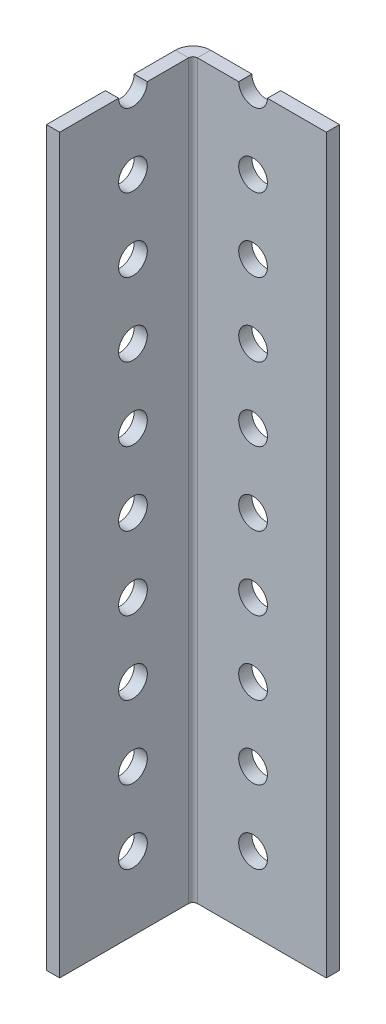
ISO-10303-21;
HEADER;
FILE_DESCRIPTION(('STEP AP214'),'2;1');
FILE_NAME('part.step','',(''),(''),'','','');
FILE_SCHEMA(('AUTOMOTIVE_DESIGN { 1 0 10303 214 1 1 1 1 }'));
ENDSEC;
DATA;
#1=APPLICATION_CONTEXT('core data for automotive mechanical design processes');
#2=APPLICATION_PROTOCOL_DEFINITION('international standard','automotive_design',2000,#1);
#3=PRODUCT_CONTEXT('',#1,'mechanical');
#4=PRODUCT('Part','Part','',(#3));
#5=PRODUCT_RELATED_PRODUCT_CATEGORY('part','',(#4));
#6=PRODUCT_DEFINITION_FORMATION('','',#4);
#7=PRODUCT_DEFINITION_CONTEXT('part definition',#1,'design');
#8=PRODUCT_DEFINITION('design','',#6,#7);
#9=PRODUCT_DEFINITION_SHAPE('','',#8);
#10=(LENGTH_UNIT() NAMED_UNIT(*) SI_UNIT(.MILLI.,.METRE.));
#11=(NAMED_UNIT(*) PLANE_ANGLE_UNIT() SI_UNIT($,.RADIAN.));
#12=(NAMED_UNIT(*) SI_UNIT($,.STERADIAN.) SOLID_ANGLE_UNIT());
#13=UNCERTAINTY_MEASURE_WITH_UNIT(LENGTH_MEASURE(1.E-05),#10,'distance_accuracy_value','');
#14=(GEOMETRIC_REPRESENTATION_CONTEXT(3) GLOBAL_UNCERTAINTY_ASSIGNED_CONTEXT((#13)) GLOBAL_UNIT_ASSIGNED_CONTEXT((#10,
#11,#12)) REPRESENTATION_CONTEXT('',''));
#15=CARTESIAN_POINT('',(0.,0.,0.));
#16=DIRECTION('',(0.,0.,1.));
#17=DIRECTION('',(1.,0.,0.));
#18=AXIS2_PLACEMENT_3D('',#15,#16,#17);
#19=CARTESIAN_POINT('',(0.,0.,18.8155418391894));
#20=DIRECTION('',(0.,1.,0.));
#21=DIRECTION('',(0.,0.,1.));
#22=AXIS2_PLACEMENT_3D('',#19,#20,#21);
#23=PLANE('',#22);
#24=DIRECTION('',(1.,0.,0.));
#25=VECTOR('',#24,1.);
#26=CARTESIAN_POINT('',(0.,0.,25.4));
#27=LINE('',#26,#25);
#28=CARTESIAN_POINT('',(0.,0.,25.4));
#29=VERTEX_POINT('',#28);
#30=CARTESIAN_POINT('',(2.286,0.,25.4));
#31=VERTEX_POINT('',#30);
#32=EDGE_CURVE('E11',#29,#31,#27,.T.);
#33=ORIENTED_EDGE('',*,*,#32,.F.);
#34=DIRECTION('',(0.,0.,1.));
#35=VECTOR('',#34,1.);
#36=CARTESIAN_POINT('',(0.,0.,18.8155418391894));
#37=LINE('',#36,#35);
#38=CARTESIAN_POINT('',(0.,0.,3.048));
#39=VERTEX_POINT('',#38);
#40=EDGE_CURVE('E81',#29,#39,#37,.F.);
#41=ORIENTED_EDGE('',*,*,#40,.T.);
#42=DIRECTION('',(-1.,0.,0.));
#43=VECTOR('',#42,1.);
#44=CARTESIAN_POINT('',(0.,0.,3.048));
#45=LINE('',#44,#43);
#46=CARTESIAN_POINT('',(2.286,0.,3.048));
#47=VERTEX_POINT('',#46);
#48=EDGE_CURVE('E28',#39,#47,#45,.F.);
#49=ORIENTED_EDGE('',*,*,#48,.T.);
#50=DIRECTION('',(0.,0.,-1.));
#51=VECTOR('',#50,1.);
#52=CARTESIAN_POINT('',(2.286,0.,18.8155418391894));
#53=LINE('',#52,#51);
#54=EDGE_CURVE('E279',#31,#47,#53,.T.);
#55=ORIENTED_EDGE('',*,*,#54,.F.);
#56=EDGE_LOOP('',(#33,#41,#49,#55));
#57=FACE_BOUND('',#56,.T.);
#58=ADVANCED_FACE('F17',(#57),#23,.F.);
#59=CARTESIAN_POINT('',(0.,127.,18.8155418391894));
#60=DIRECTION('',(0.,1.,0.));
#61=DIRECTION('',(0.,0.,1.));
#62=AXIS2_PLACEMENT_3D('',#59,#60,#61);
#63=PLANE('',#62);
#64=DIRECTION('',(1.,0.,0.));
#65=VECTOR('',#64,1.);
#66=CARTESIAN_POINT('',(0.,127.,3.048));
#67=LINE('',#66,#65);
#68=CARTESIAN_POINT('',(0.,127.,3.048));
#69=VERTEX_POINT('',#68);
#70=CARTESIAN_POINT('',(2.286,127.,3.048));
#71=VERTEX_POINT('',#70);
#72=EDGE_CURVE('E70',#69,#71,#67,.T.);
#73=ORIENTED_EDGE('',*,*,#72,.F.);
#74=DIRECTION('',(0.,0.,1.));
#75=VECTOR('',#74,1.);
#76=CARTESIAN_POINT('',(0.,127.,18.8155418391894));
#77=LINE('',#76,#75);
#78=CARTESIAN_POINT('',(0.,127.,10.2108));
#79=VERTEX_POINT('',#78);
#80=EDGE_CURVE('E84',#79,#69,#77,.F.);
#81=ORIENTED_EDGE('',*,*,#80,.F.);
#82=DIRECTION('',(1.,0.,0.));
#83=VECTOR('',#82,1.);
#84=CARTESIAN_POINT('',(0.,127.,10.2108));
#85=LINE('',#84,#83);
#86=CARTESIAN_POINT('',(2.28599999999997,127.,10.2108));
#87=VERTEX_POINT('',#86);
#88=EDGE_CURVE('E365',#79,#87,#85,.T.);
#89=ORIENTED_EDGE('',*,*,#88,.T.);
#90=DIRECTION('',(0.,0.,-1.));
#91=VECTOR('',#90,1.);
#92=CARTESIAN_POINT('',(2.286,127.,18.8155418391894));
#93=LINE('',#92,#91);
#94=EDGE_CURVE('E275',#87,#71,#93,.T.);
#95=ORIENTED_EDGE('',*,*,#94,.T.);
#96=EDGE_LOOP('',(#73,#81,#89,#95));
#97=FACE_BOUND('',#96,.T.);
#98=ADVANCED_FACE('F446',(#97),#63,.T.);
#99=CARTESIAN_POINT('',(0.,127.,12.7));
#100=DIRECTION('',(1.,0.,0.));
#101=DIRECTION('',(0.,0.,-1.));
#102=AXIS2_PLACEMENT_3D('',#99,#100,#101);
#103=CYLINDRICAL_SURFACE('',#102,2.4892);
#104=ORIENTED_EDGE('',*,*,#88,.F.);
#105=CARTESIAN_POINT('',(0.,127.,12.7));
#106=DIRECTION('',(-1.,0.,0.));
#107=DIRECTION('',(0.,0.,1.));
#108=AXIS2_PLACEMENT_3D('',#105,#106,#107);
#109=CIRCLE('',#108,2.4892);
#110=CARTESIAN_POINT('',(0.,127.,15.1892));
#111=VERTEX_POINT('',#110);
#112=EDGE_CURVE('E325',#79,#111,#109,.T.);
#113=ORIENTED_EDGE('',*,*,#112,.T.);
#114=DIRECTION('',(1.,0.,0.));
#115=VECTOR('',#114,1.);
#116=CARTESIAN_POINT('',(0.,127.,15.1892));
#117=LINE('',#116,#115);
#118=CARTESIAN_POINT('',(2.28599999999997,127.,15.1892));
#119=VERTEX_POINT('',#118);
#120=EDGE_CURVE('E37',#111,#119,#117,.T.);
#121=ORIENTED_EDGE('',*,*,#120,.T.);
#122=CARTESIAN_POINT('',(2.28599999999997,127.,12.7));
#123=DIRECTION('',(-1.,0.,0.));
#124=DIRECTION('',(0.,0.,1.));
#125=AXIS2_PLACEMENT_3D('',#122,#123,#124);
#126=CIRCLE('',#125,2.4892);
#127=EDGE_CURVE('E270',#87,#119,#126,.T.);
#128=ORIENTED_EDGE('',*,*,#127,.F.);
#129=EDGE_LOOP('',(#104,#113,#121,#128));
#130=FACE_BOUND('',#129,.T.);
#131=ADVANCED_FACE('F450',(#130),#103,.F.);
#132=ORIENTED_EDGE('',*,*,#120,.F.);
#133=CARTESIAN_POINT('',(0.,127.,25.4));
#134=VERTEX_POINT('',#133);
#135=EDGE_CURVE('E264',#134,#111,#77,.F.);
#136=ORIENTED_EDGE('',*,*,#135,.F.);
#137=DIRECTION('',(1.,0.,0.));
#138=VECTOR('',#137,1.);
#139=CARTESIAN_POINT('',(0.,127.,25.4));
#140=LINE('',#139,#138);
#141=CARTESIAN_POINT('',(2.286,127.,25.4));
#142=VERTEX_POINT('',#141);
#143=EDGE_CURVE('E320',#134,#142,#140,.T.);
#144=ORIENTED_EDGE('',*,*,#143,.T.);
#145=DIRECTION('',(0.,0.,-1.));
#146=VECTOR('',#145,1.);
#147=CARTESIAN_POINT('',(2.286,127.,18.8155418391894));
#148=LINE('',#147,#146);
#149=EDGE_CURVE('E265',#142,#119,#148,.T.);
#150=ORIENTED_EDGE('',*,*,#149,.T.);
#151=EDGE_LOOP('',(#132,#136,#144,#150));
#152=FACE_BOUND('',#151,.T.);
#153=ADVANCED_FACE('F452',(#152),#63,.T.);
#154=CARTESIAN_POINT('',(0.,0.,25.4));
#155=DIRECTION('',(0.,0.,-1.));
#156=DIRECTION('',(0.,1.,0.));
#157=AXIS2_PLACEMENT_3D('',#154,#155,#156);
#158=PLANE('',#157);
#159=DIRECTION('',(0.,1.,0.));
#160=VECTOR('',#159,1.);
#161=CARTESIAN_POINT('',(0.,0.,25.4));
#162=LINE('',#161,#160);
#163=EDGE_CURVE('E95',#29,#134,#162,.T.);
#164=ORIENTED_EDGE('',*,*,#163,.F.);
#165=ORIENTED_EDGE('',*,*,#32,.T.);
#166=DIRECTION('',(0.,1.,0.));
#167=VECTOR('',#166,1.);
#168=CARTESIAN_POINT('',(2.286,0.,25.4));
#169=LINE('',#168,#167);
#170=EDGE_CURVE('E268',#31,#142,#169,.T.);
#171=ORIENTED_EDGE('',*,*,#170,.T.);
#172=ORIENTED_EDGE('',*,*,#143,.F.);
#173=EDGE_LOOP('',(#164,#165,#171,#172));
#174=FACE_BOUND('',#173,.T.);
#175=ADVANCED_FACE('F455',(#174),#158,.F.);
#176=CARTESIAN_POINT('',(0.,114.3,12.7));
#177=DIRECTION('',(1.,0.,0.));
#178=DIRECTION('',(0.,0.,-1.));
#179=AXIS2_PLACEMENT_3D('',#176,#177,#178);
#180=CYLINDRICAL_SURFACE('',#179,2.4892);
#181=CARTESIAN_POINT('',(2.28599999999997,114.3,12.7));
#182=DIRECTION('',(-1.,0.,0.));
#183=DIRECTION('',(0.,0.,1.));
#184=AXIS2_PLACEMENT_3D('',#181,#182,#183);
#185=CIRCLE('',#184,2.4892);
#186=CARTESIAN_POINT('',(2.28599999999996,114.3,15.1892));
#187=VERTEX_POINT('',#186);
#188=EDGE_CURVE('E274',#187,#187,#185,.T.);
#189=ORIENTED_EDGE('',*,*,#188,.F.);
#190=EDGE_LOOP('',(#189));
#191=FACE_BOUND('',#190,.T.);
#192=CARTESIAN_POINT('',(0.,114.3,12.7));
#193=DIRECTION('',(-1.,0.,0.));
#194=DIRECTION('',(0.,0.,1.));
#195=AXIS2_PLACEMENT_3D('',#192,#193,#194);
#196=CIRCLE('',#195,2.4892);
#197=CARTESIAN_POINT('',(0.,114.3,15.1892));
#198=VERTEX_POINT('',#197);
#199=EDGE_CURVE('E328',#198,#198,#196,.T.);
#200=ORIENTED_EDGE('',*,*,#199,.T.);
#201=EDGE_LOOP('',(#200));
#202=FACE_BOUND('',#201,.T.);
#203=ADVANCED_FACE('F458',(#191,#202),#180,.F.);
#204=CARTESIAN_POINT('',(0.,101.6,12.7));
#205=DIRECTION('',(1.,0.,0.));
#206=DIRECTION('',(0.,0.,-1.));
#207=AXIS2_PLACEMENT_3D('',#204,#205,#206);
#208=CYLINDRICAL_SURFACE('',#207,2.4892);
#209=CARTESIAN_POINT('',(2.28599999999997,101.6,12.7));
#210=DIRECTION('',(-1.,0.,0.));
#211=DIRECTION('',(0.,0.,1.));
#212=AXIS2_PLACEMENT_3D('',#209,#210,#211);
#213=CIRCLE('',#212,2.4892);
#214=CARTESIAN_POINT('',(2.28599999999996,101.6,15.1892));
#215=VERTEX_POINT('',#214);
#216=EDGE_CURVE('E288',#215,#215,#213,.T.);
#217=ORIENTED_EDGE('',*,*,#216,.F.);
#218=EDGE_LOOP('',(#217));
#219=FACE_BOUND('',#218,.T.);
#220=CARTESIAN_POINT('',(0.,101.6,12.7));
#221=DIRECTION('',(-1.,0.,0.));
#222=DIRECTION('',(0.,0.,1.));
#223=AXIS2_PLACEMENT_3D('',#220,#221,#222);
#224=CIRCLE('',#223,2.4892);
#225=CARTESIAN_POINT('',(0.,101.6,15.1892));
#226=VERTEX_POINT('',#225);
#227=EDGE_CURVE('E332',#226,#226,#224,.T.);
#228=ORIENTED_EDGE('',*,*,#227,.T.);
#229=EDGE_LOOP('',(#228));
#230=FACE_BOUND('',#229,.T.);
#231=ADVANCED_FACE('F462',(#219,#230),#208,.F.);
#232=CARTESIAN_POINT('',(0.,88.9,12.7));
#233=DIRECTION('',(1.,0.,0.));
#234=DIRECTION('',(0.,0.,-1.));
#235=AXIS2_PLACEMENT_3D('',#232,#233,#234);
#236=CYLINDRICAL_SURFACE('',#235,2.4892);
#237=CARTESIAN_POINT('',(2.28599999999997,88.9,12.7));
#238=DIRECTION('',(-1.,0.,0.));
#239=DIRECTION('',(0.,0.,1.));
#240=AXIS2_PLACEMENT_3D('',#237,#238,#239);
#241=CIRCLE('',#240,2.4892);
#242=CARTESIAN_POINT('',(2.28599999999996,88.9,15.1892));
#243=VERTEX_POINT('',#242);
#244=EDGE_CURVE('E292',#243,#243,#241,.T.);
#245=ORIENTED_EDGE('',*,*,#244,.F.);
#246=EDGE_LOOP('',(#245));
#247=FACE_BOUND('',#246,.T.);
#248=CARTESIAN_POINT('',(0.,88.9,12.7));
#249=DIRECTION('',(-1.,0.,0.));
#250=DIRECTION('',(0.,0.,1.));
#251=AXIS2_PLACEMENT_3D('',#248,#249,#250);
#252=CIRCLE('',#251,2.4892);
#253=CARTESIAN_POINT('',(0.,88.9,15.1892));
#254=VERTEX_POINT('',#253);
#255=EDGE_CURVE('E336',#254,#254,#252,.T.);
#256=ORIENTED_EDGE('',*,*,#255,.T.);
#257=EDGE_LOOP('',(#256));
#258=FACE_BOUND('',#257,.T.);
#259=ADVANCED_FACE('F466',(#247,#258),#236,.F.);
#260=CARTESIAN_POINT('',(0.,76.2,12.7));
#261=DIRECTION('',(1.,0.,0.));
#262=DIRECTION('',(0.,0.,-1.));
#263=AXIS2_PLACEMENT_3D('',#260,#261,#262);
#264=CYLINDRICAL_SURFACE('',#263,2.4892);
#265=CARTESIAN_POINT('',(2.28599999999997,76.2,12.7));
#266=DIRECTION('',(-1.,0.,0.));
#267=DIRECTION('',(0.,0.,1.));
#268=AXIS2_PLACEMENT_3D('',#265,#266,#267);
#269=CIRCLE('',#268,2.4892);
#270=CARTESIAN_POINT('',(2.28599999999996,76.2,15.1892));
#271=VERTEX_POINT('',#270);
#272=EDGE_CURVE('E296',#271,#271,#269,.T.);
#273=ORIENTED_EDGE('',*,*,#272,.F.);
#274=EDGE_LOOP('',(#273));
#275=FACE_BOUND('',#274,.T.);
#276=CARTESIAN_POINT('',(0.,76.2,12.7));
#277=DIRECTION('',(-1.,0.,0.));
#278=DIRECTION('',(0.,0.,1.));
#279=AXIS2_PLACEMENT_3D('',#276,#277,#278);
#280=CIRCLE('',#279,2.4892);
#281=CARTESIAN_POINT('',(0.,76.2,15.1892));
#282=VERTEX_POINT('',#281);
#283=EDGE_CURVE('E340',#282,#282,#280,.T.);
#284=ORIENTED_EDGE('',*,*,#283,.T.);
#285=EDGE_LOOP('',(#284));
#286=FACE_BOUND('',#285,.T.);
#287=ADVANCED_FACE('F470',(#275,#286),#264,.F.);
#288=CARTESIAN_POINT('',(0.,63.5,12.7));
#289=DIRECTION('',(1.,0.,0.));
#290=DIRECTION('',(0.,0.,-1.));
#291=AXIS2_PLACEMENT_3D('',#288,#289,#290);
#292=CYLINDRICAL_SURFACE('',#291,2.4892);
#293=CARTESIAN_POINT('',(2.28599999999997,63.5,12.7));
#294=DIRECTION('',(-1.,0.,0.));
#295=DIRECTION('',(0.,0.,1.));
#296=AXIS2_PLACEMENT_3D('',#293,#294,#295);
#297=CIRCLE('',#296,2.4892);
#298=CARTESIAN_POINT('',(2.28599999999996,63.5,15.1892));
#299=VERTEX_POINT('',#298);
#300=EDGE_CURVE('E300',#299,#299,#297,.T.);
#301=ORIENTED_EDGE('',*,*,#300,.F.);
#302=EDGE_LOOP('',(#301));
#303=FACE_BOUND('',#302,.T.);
#304=CARTESIAN_POINT('',(0.,63.5,12.7));
#305=DIRECTION('',(-1.,0.,0.));
#306=DIRECTION('',(0.,0.,1.));
#307=AXIS2_PLACEMENT_3D('',#304,#305,#306);
#308=CIRCLE('',#307,2.4892);
#309=CARTESIAN_POINT('',(0.,63.5,15.1892));
#310=VERTEX_POINT('',#309);
#311=EDGE_CURVE('E344',#310,#310,#308,.T.);
#312=ORIENTED_EDGE('',*,*,#311,.T.);
#313=EDGE_LOOP('',(#312));
#314=FACE_BOUND('',#313,.T.);
#315=ADVANCED_FACE('F474',(#303,#314),#292,.F.);
#316=CARTESIAN_POINT('',(0.,50.8,12.7));
#317=DIRECTION('',(1.,0.,0.));
#318=DIRECTION('',(0.,0.,-1.));
#319=AXIS2_PLACEMENT_3D('',#316,#317,#318);
#320=CYLINDRICAL_SURFACE('',#319,2.4892);
#321=CARTESIAN_POINT('',(2.28599999999997,50.8,12.7));
#322=DIRECTION('',(-1.,0.,0.));
#323=DIRECTION('',(0.,0.,1.));
#324=AXIS2_PLACEMENT_3D('',#321,#322,#323);
#325=CIRCLE('',#324,2.4892);
#326=CARTESIAN_POINT('',(2.28599999999996,50.8,15.1892));
#327=VERTEX_POINT('',#326);
#328=EDGE_CURVE('E304',#327,#327,#325,.T.);
#329=ORIENTED_EDGE('',*,*,#328,.F.);
#330=EDGE_LOOP('',(#329));
#331=FACE_BOUND('',#330,.T.);
#332=CARTESIAN_POINT('',(0.,50.8,12.7));
#333=DIRECTION('',(-1.,0.,0.));
#334=DIRECTION('',(0.,0.,1.));
#335=AXIS2_PLACEMENT_3D('',#332,#333,#334);
#336=CIRCLE('',#335,2.4892);
#337=CARTESIAN_POINT('',(0.,50.8,15.1892));
#338=VERTEX_POINT('',#337);
#339=EDGE_CURVE('E348',#338,#338,#336,.T.);
#340=ORIENTED_EDGE('',*,*,#339,.T.);
#341=EDGE_LOOP('',(#340));
#342=FACE_BOUND('',#341,.T.);
#343=ADVANCED_FACE('F478',(#331,#342),#320,.F.);
#344=CARTESIAN_POINT('',(0.,38.1,12.7));
#345=DIRECTION('',(1.,0.,0.));
#346=DIRECTION('',(0.,0.,-1.));
#347=AXIS2_PLACEMENT_3D('',#344,#345,#346);
#348=CYLINDRICAL_SURFACE('',#347,2.4892);
#349=CARTESIAN_POINT('',(2.28599999999997,38.1,12.7));
#350=DIRECTION('',(-1.,0.,0.));
#351=DIRECTION('',(0.,0.,1.));
#352=AXIS2_PLACEMENT_3D('',#349,#350,#351);
#353=CIRCLE('',#352,2.4892);
#354=CARTESIAN_POINT('',(2.28599999999996,38.1,15.1892));
#355=VERTEX_POINT('',#354);
#356=EDGE_CURVE('E308',#355,#355,#353,.T.);
#357=ORIENTED_EDGE('',*,*,#356,.F.);
#358=EDGE_LOOP('',(#357));
#359=FACE_BOUND('',#358,.T.);
#360=CARTESIAN_POINT('',(0.,38.1,12.7));
#361=DIRECTION('',(-1.,0.,0.));
#362=DIRECTION('',(0.,0.,1.));
#363=AXIS2_PLACEMENT_3D('',#360,#361,#362);
#364=CIRCLE('',#363,2.4892);
#365=CARTESIAN_POINT('',(0.,38.1,15.1892));
#366=VERTEX_POINT('',#365);
#367=EDGE_CURVE('E352',#366,#366,#364,.T.);
#368=ORIENTED_EDGE('',*,*,#367,.T.);
#369=EDGE_LOOP('',(#368));
#370=FACE_BOUND('',#369,.T.);
#371=ADVANCED_FACE('F482',(#359,#370),#348,.F.);
#372=CARTESIAN_POINT('',(0.,25.4,12.7));
#373=DIRECTION('',(1.,0.,0.));
#374=DIRECTION('',(0.,0.,-1.));
#375=AXIS2_PLACEMENT_3D('',#372,#373,#374);
#376=CYLINDRICAL_SURFACE('',#375,2.4892);
#377=CARTESIAN_POINT('',(2.28599999999997,25.4,12.7));
#378=DIRECTION('',(-1.,0.,0.));
#379=DIRECTION('',(0.,0.,1.));
#380=AXIS2_PLACEMENT_3D('',#377,#378,#379);
#381=CIRCLE('',#380,2.4892);
#382=CARTESIAN_POINT('',(2.28599999999996,25.4,15.1892));
#383=VERTEX_POINT('',#382);
#384=EDGE_CURVE('E312',#383,#383,#381,.T.);
#385=ORIENTED_EDGE('',*,*,#384,.F.);
#386=EDGE_LOOP('',(#385));
#387=FACE_BOUND('',#386,.T.);
#388=CARTESIAN_POINT('',(0.,25.4,12.7));
#389=DIRECTION('',(-1.,0.,0.));
#390=DIRECTION('',(0.,0.,1.));
#391=AXIS2_PLACEMENT_3D('',#388,#389,#390);
#392=CIRCLE('',#391,2.4892);
#393=CARTESIAN_POINT('',(0.,25.4,15.1892));
#394=VERTEX_POINT('',#393);
#395=EDGE_CURVE('E356',#394,#394,#392,.T.);
#396=ORIENTED_EDGE('',*,*,#395,.T.);
#397=EDGE_LOOP('',(#396));
#398=FACE_BOUND('',#397,.T.);
#399=ADVANCED_FACE('F485',(#387,#398),#376,.F.);
#400=CARTESIAN_POINT('',(0.,12.7,12.7));
#401=DIRECTION('',(1.,0.,0.));
#402=DIRECTION('',(0.,0.,-1.));
#403=AXIS2_PLACEMENT_3D('',#400,#401,#402);
#404=CYLINDRICAL_SURFACE('',#403,2.4892);
#405=CARTESIAN_POINT('',(2.28599999999997,12.7,12.7));
#406=DIRECTION('',(-1.,0.,0.));
#407=DIRECTION('',(0.,0.,1.));
#408=AXIS2_PLACEMENT_3D('',#405,#406,#407);
#409=CIRCLE('',#408,2.4892);
#410=CARTESIAN_POINT('',(2.28599999999996,12.7,15.1892));
#411=VERTEX_POINT('',#410);
#412=EDGE_CURVE('E316',#411,#411,#409,.T.);
#413=ORIENTED_EDGE('',*,*,#412,.F.);
#414=EDGE_LOOP('',(#413));
#415=FACE_BOUND('',#414,.T.);
#416=CARTESIAN_POINT('',(0.,12.7,12.7));
#417=DIRECTION('',(-1.,0.,0.));
#418=DIRECTION('',(0.,0.,1.));
#419=AXIS2_PLACEMENT_3D('',#416,#417,#418);
#420=CIRCLE('',#419,2.4892);
#421=CARTESIAN_POINT('',(0.,12.7,15.1892));
#422=VERTEX_POINT('',#421);
#423=EDGE_CURVE('E269',#422,#422,#420,.T.);
#424=ORIENTED_EDGE('',*,*,#423,.T.);
#425=EDGE_LOOP('',(#424));
#426=FACE_BOUND('',#425,.T.);
#427=ADVANCED_FACE('F19',(#415,#426),#404,.F.);
#428=CARTESIAN_POINT('',(2.286,0.,18.8155418391894));
#429=DIRECTION('',(1.,0.,0.));
#430=DIRECTION('',(0.,0.,-1.));
#431=AXIS2_PLACEMENT_3D('',#428,#429,#430);
#432=PLANE('',#431);
#433=ORIENTED_EDGE('',*,*,#149,.F.);
#434=ORIENTED_EDGE('',*,*,#170,.F.);
#435=ORIENTED_EDGE('',*,*,#54,.T.);
#436=DIRECTION('',(0.,1.,0.));
#437=VECTOR('',#436,1.);
#438=CARTESIAN_POINT('',(2.286,0.,3.048));
#439=LINE('',#438,#437);
#440=EDGE_CURVE('E278',#47,#71,#439,.T.);
#441=ORIENTED_EDGE('',*,*,#440,.T.);
#442=ORIENTED_EDGE('',*,*,#94,.F.);
#443=ORIENTED_EDGE('',*,*,#127,.T.);
#444=EDGE_LOOP('',(#433,#434,#435,#441,#442,#443));
#445=FACE_BOUND('',#444,.T.);
#446=ORIENTED_EDGE('',*,*,#188,.T.);
#447=EDGE_LOOP('',(#446));
#448=FACE_BOUND('',#447,.T.);
#449=ORIENTED_EDGE('',*,*,#216,.T.);
#450=EDGE_LOOP('',(#449));
#451=FACE_BOUND('',#450,.T.);
#452=ORIENTED_EDGE('',*,*,#244,.T.);
#453=EDGE_LOOP('',(#452));
#454=FACE_BOUND('',#453,.T.);
#455=ORIENTED_EDGE('',*,*,#272,.T.);
#456=EDGE_LOOP('',(#455));
#457=FACE_BOUND('',#456,.T.);
#458=ORIENTED_EDGE('',*,*,#300,.T.);
#459=EDGE_LOOP('',(#458));
#460=FACE_BOUND('',#459,.T.);
#461=ORIENTED_EDGE('',*,*,#328,.T.);
#462=EDGE_LOOP('',(#461));
#463=FACE_BOUND('',#462,.T.);
#464=ORIENTED_EDGE('',*,*,#356,.T.);
#465=EDGE_LOOP('',(#464));
#466=FACE_BOUND('',#465,.T.);
#467=ORIENTED_EDGE('',*,*,#384,.T.);
#468=EDGE_LOOP('',(#467));
#469=FACE_BOUND('',#468,.T.);
#470=ORIENTED_EDGE('',*,*,#412,.T.);
#471=EDGE_LOOP('',(#470));
#472=FACE_BOUND('',#471,.T.);
#473=ADVANCED_FACE('F491',(#445,#448,#451,#454,#457,#460,#463,#466,#469,#472),#432,.T.);
#474=CARTESIAN_POINT('',(0.,0.,18.8155418391894));
#475=DIRECTION('',(1.,0.,0.));
#476=DIRECTION('',(0.,0.,-1.));
#477=AXIS2_PLACEMENT_3D('',#474,#475,#476);
#478=PLANE('',#477);
#479=ORIENTED_EDGE('',*,*,#135,.T.);
#480=ORIENTED_EDGE('',*,*,#112,.F.);
#481=ORIENTED_EDGE('',*,*,#80,.T.);
#482=DIRECTION('',(0.,1.,0.));
#483=VECTOR('',#482,1.);
#484=CARTESIAN_POINT('',(0.,0.,3.048));
#485=LINE('',#484,#483);
#486=EDGE_CURVE('E21',#39,#69,#485,.T.);
#487=ORIENTED_EDGE('',*,*,#486,.F.);
#488=ORIENTED_EDGE('',*,*,#40,.F.);
#489=ORIENTED_EDGE('',*,*,#163,.T.);
#490=EDGE_LOOP('',(#479,#480,#481,#487,#488,#489));
#491=FACE_BOUND('',#490,.T.);
#492=ORIENTED_EDGE('',*,*,#199,.F.);
#493=EDGE_LOOP('',(#492));
#494=FACE_BOUND('',#493,.T.);
#495=ORIENTED_EDGE('',*,*,#227,.F.);
#496=EDGE_LOOP('',(#495));
#497=FACE_BOUND('',#496,.T.);
#498=ORIENTED_EDGE('',*,*,#255,.F.);
#499=EDGE_LOOP('',(#498));
#500=FACE_BOUND('',#499,.T.);
#501=ORIENTED_EDGE('',*,*,#283,.F.);
#502=EDGE_LOOP('',(#501));
#503=FACE_BOUND('',#502,.T.);
#504=ORIENTED_EDGE('',*,*,#311,.F.);
#505=EDGE_LOOP('',(#504));
#506=FACE_BOUND('',#505,.T.);
#507=ORIENTED_EDGE('',*,*,#339,.F.);
#508=EDGE_LOOP('',(#507));
#509=FACE_BOUND('',#508,.T.);
#510=ORIENTED_EDGE('',*,*,#367,.F.);
#511=EDGE_LOOP('',(#510));
#512=FACE_BOUND('',#511,.T.);
#513=ORIENTED_EDGE('',*,*,#395,.F.);
#514=EDGE_LOOP('',(#513));
#515=FACE_BOUND('',#514,.T.);
#516=ORIENTED_EDGE('',*,*,#423,.F.);
#517=EDGE_LOOP('',(#516));
#518=FACE_BOUND('',#517,.T.);
#519=ADVANCED_FACE('F78',(#491,#494,#497,#500,#503,#506,#509,#512,#515,#518),#478,.F.);
#520=CARTESIAN_POINT('',(15.3032662346959,0.,0.));
#521=DIRECTION('',(0.,-1.,0.));
#522=DIRECTION('',(1.,0.,0.));
#523=AXIS2_PLACEMENT_3D('',#520,#521,#522);
#524=PLANE('',#523);
#525=DIRECTION('',(0.,0.,-1.));
#526=VECTOR('',#525,1.);
#527=CARTESIAN_POINT('',(3.048,0.,0.));
#528=LINE('',#527,#526);
#529=CARTESIAN_POINT('',(3.048,0.,0.));
#530=VERTEX_POINT('',#529);
#531=CARTESIAN_POINT('',(3.048,0.,2.286));
#532=VERTEX_POINT('',#531);
#533=EDGE_CURVE('E253',#530,#532,#528,.F.);
#534=ORIENTED_EDGE('',*,*,#533,.F.);
#535=DIRECTION('',(1.,0.,0.));
#536=VECTOR('',#535,1.);
#537=CARTESIAN_POINT('',(15.3032662346959,0.,0.));
#538=LINE('',#537,#536);
#539=CARTESIAN_POINT('',(25.4,0.,0.));
#540=VERTEX_POINT('',#539);
#541=EDGE_CURVE('E194',#530,#540,#538,.T.);
#542=ORIENTED_EDGE('',*,*,#541,.T.);
#543=DIRECTION('',(0.,0.,1.));
#544=VECTOR('',#543,1.);
#545=CARTESIAN_POINT('',(25.4,0.,0.));
#546=LINE('',#545,#544);
#547=CARTESIAN_POINT('',(25.4,0.,2.286));
#548=VERTEX_POINT('',#547);
#549=EDGE_CURVE('E249',#540,#548,#546,.T.);
#550=ORIENTED_EDGE('',*,*,#549,.T.);
#551=DIRECTION('',(1.,0.,0.));
#552=VECTOR('',#551,1.);
#553=CARTESIAN_POINT('',(15.3032662346959,0.,2.286));
#554=LINE('',#553,#552);
#555=EDGE_CURVE('E150',#532,#548,#554,.T.);
#556=ORIENTED_EDGE('',*,*,#555,.F.);
#557=EDGE_LOOP('',(#534,#542,#550,#556));
#558=FACE_BOUND('',#557,.T.);
#559=ADVANCED_FACE('F396',(#558),#524,.T.);
#560=CARTESIAN_POINT('',(25.4,0.,0.));
#561=DIRECTION('',(1.,0.,0.));
#562=DIRECTION('',(0.,1.,0.));
#563=AXIS2_PLACEMENT_3D('',#560,#561,#562);
#564=PLANE('',#563);
#565=ORIENTED_EDGE('',*,*,#549,.F.);
#566=DIRECTION('',(0.,1.,0.));
#567=VECTOR('',#566,1.);
#568=CARTESIAN_POINT('',(25.4,0.,0.));
#569=LINE('',#568,#567);
#570=CARTESIAN_POINT('',(25.4,127.,0.));
#571=VERTEX_POINT('',#570);
#572=EDGE_CURVE('E198',#540,#571,#569,.T.);
#573=ORIENTED_EDGE('',*,*,#572,.T.);
#574=DIRECTION('',(0.,0.,1.));
#575=VECTOR('',#574,1.);
#576=CARTESIAN_POINT('',(25.4,127.,0.));
#577=LINE('',#576,#575);
#578=CARTESIAN_POINT('',(25.4,127.,2.286));
#579=VERTEX_POINT('',#578);
#580=EDGE_CURVE('E245',#571,#579,#577,.T.);
#581=ORIENTED_EDGE('',*,*,#580,.T.);
#582=DIRECTION('',(0.,1.,0.));
#583=VECTOR('',#582,1.);
#584=CARTESIAN_POINT('',(25.4,0.,2.286));
#585=LINE('',#584,#583);
#586=EDGE_CURVE('E146',#548,#579,#585,.T.);
#587=ORIENTED_EDGE('',*,*,#586,.F.);
#588=EDGE_LOOP('',(#565,#573,#581,#587));
#589=FACE_BOUND('',#588,.T.);
#590=ADVANCED_FACE('F404',(#589),#564,.T.);
#591=CARTESIAN_POINT('',(15.3032662346959,127.,0.));
#592=DIRECTION('',(0.,-1.,0.));
#593=DIRECTION('',(1.,0.,0.));
#594=AXIS2_PLACEMENT_3D('',#591,#592,#593);
#595=PLANE('',#594);
#596=ORIENTED_EDGE('',*,*,#580,.F.);
#597=DIRECTION('',(1.,0.,0.));
#598=VECTOR('',#597,1.);
#599=CARTESIAN_POINT('',(15.3032662346959,127.,0.));
#600=LINE('',#599,#598);
#601=CARTESIAN_POINT('',(15.1892,127.,0.));
#602=VERTEX_POINT('',#601);
#603=EDGE_CURVE('E193',#602,#571,#600,.T.);
#604=ORIENTED_EDGE('',*,*,#603,.F.);
#605=DIRECTION('',(0.,0.,1.));
#606=VECTOR('',#605,1.);
#607=CARTESIAN_POINT('',(15.1892,127.,0.));
#608=LINE('',#607,#606);
#609=CARTESIAN_POINT('',(15.1892,127.,2.286));
#610=VERTEX_POINT('',#609);
#611=EDGE_CURVE('E241',#602,#610,#608,.T.);
#612=ORIENTED_EDGE('',*,*,#611,.T.);
#613=DIRECTION('',(1.,0.,0.));
#614=VECTOR('',#613,1.);
#615=CARTESIAN_POINT('',(15.3032662346959,127.,2.286));
#616=LINE('',#615,#614);
#617=EDGE_CURVE('E142',#610,#579,#616,.T.);
#618=ORIENTED_EDGE('',*,*,#617,.T.);
#619=EDGE_LOOP('',(#596,#604,#612,#618));
#620=FACE_BOUND('',#619,.T.);
#621=ADVANCED_FACE('F420',(#620),#595,.F.);
#622=CARTESIAN_POINT('',(12.7,127.,0.));
#623=DIRECTION('',(0.,0.,1.));
#624=DIRECTION('',(1.,0.,0.));
#625=AXIS2_PLACEMENT_3D('',#622,#623,#624);
#626=CYLINDRICAL_SURFACE('',#625,2.4892);
#627=ORIENTED_EDGE('',*,*,#611,.F.);
#628=CARTESIAN_POINT('',(12.7,127.,0.));
#629=DIRECTION('',(0.,0.,1.));
#630=DIRECTION('',(1.,0.,0.));
#631=AXIS2_PLACEMENT_3D('',#628,#629,#630);
#632=CIRCLE('',#631,2.4892);
#633=CARTESIAN_POINT('',(10.2108,127.,0.));
#634=VERTEX_POINT('',#633);
#635=EDGE_CURVE('E202',#634,#602,#632,.T.);
#636=ORIENTED_EDGE('',*,*,#635,.F.);
#637=DIRECTION('',(0.,0.,1.));
#638=VECTOR('',#637,1.);
#639=CARTESIAN_POINT('',(10.2108,127.,0.));
#640=LINE('',#639,#638);
#641=CARTESIAN_POINT('',(10.2108,127.,2.286));
#642=VERTEX_POINT('',#641);
#643=EDGE_CURVE('E237',#634,#642,#640,.T.);
#644=ORIENTED_EDGE('',*,*,#643,.T.);
#645=CARTESIAN_POINT('',(12.7,127.,2.286));
#646=DIRECTION('',(0.,0.,1.));
#647=DIRECTION('',(1.,0.,0.));
#648=AXIS2_PLACEMENT_3D('',#645,#646,#647);
#649=CIRCLE('',#648,2.4892);
#650=EDGE_CURVE('E137',#642,#610,#649,.T.);
#651=ORIENTED_EDGE('',*,*,#650,.T.);
#652=EDGE_LOOP('',(#627,#636,#644,#651));
#653=FACE_BOUND('',#652,.T.);
#654=ADVANCED_FACE('F435',(#653),#626,.F.);
#655=ORIENTED_EDGE('',*,*,#643,.F.);
#656=CARTESIAN_POINT('',(3.048,127.,0.));
#657=VERTEX_POINT('',#656);
#658=EDGE_CURVE('E189',#657,#634,#600,.T.);
#659=ORIENTED_EDGE('',*,*,#658,.F.);
#660=DIRECTION('',(0.,0.,1.));
#661=VECTOR('',#660,1.);
#662=CARTESIAN_POINT('',(3.048,127.,0.));
#663=LINE('',#662,#661);
#664=CARTESIAN_POINT('',(3.048,127.,2.286));
#665=VERTEX_POINT('',#664);
#666=EDGE_CURVE('E185',#657,#665,#663,.T.);
#667=ORIENTED_EDGE('',*,*,#666,.T.);
#668=DIRECTION('',(1.,0.,0.));
#669=VECTOR('',#668,1.);
#670=CARTESIAN_POINT('',(15.3032662346959,127.,2.286));
#671=LINE('',#670,#669);
#672=EDGE_CURVE('E131',#665,#642,#671,.T.);
#673=ORIENTED_EDGE('',*,*,#672,.T.);
#674=EDGE_LOOP('',(#655,#659,#667,#673));
#675=FACE_BOUND('',#674,.T.);
#676=ADVANCED_FACE('F434',(#675),#595,.F.);
#677=CARTESIAN_POINT('',(12.7,12.7,0.));
#678=DIRECTION('',(0.,0.,1.));
#679=DIRECTION('',(1.,0.,0.));
#680=AXIS2_PLACEMENT_3D('',#677,#678,#679);
#681=CYLINDRICAL_SURFACE('',#680,2.4892);
#682=CARTESIAN_POINT('',(12.7,12.7,2.286));
#683=DIRECTION('',(0.,0.,1.));
#684=DIRECTION('',(1.,0.,0.));
#685=AXIS2_PLACEMENT_3D('',#682,#683,#684);
#686=CIRCLE('',#685,2.4892);
#687=CARTESIAN_POINT('',(15.1892,12.7,2.286));
#688=VERTEX_POINT('',#687);
#689=EDGE_CURVE('E128',#688,#688,#686,.T.);
#690=ORIENTED_EDGE('',*,*,#689,.T.);
#691=EDGE_LOOP('',(#690));
#692=FACE_BOUND('',#691,.T.);
#693=CARTESIAN_POINT('',(12.7,12.7,0.));
#694=DIRECTION('',(0.,0.,1.));
#695=DIRECTION('',(1.,0.,0.));
#696=AXIS2_PLACEMENT_3D('',#693,#694,#695);
#697=CIRCLE('',#696,2.4892);
#698=CARTESIAN_POINT('',(15.1892,12.7,0.));
#699=VERTEX_POINT('',#698);
#700=EDGE_CURVE('E120',#699,#699,#697,.T.);
#701=ORIENTED_EDGE('',*,*,#700,.F.);
#702=EDGE_LOOP('',(#701));
#703=FACE_BOUND('',#702,.T.);
#704=ADVANCED_FACE('F442',(#692,#703),#681,.F.);
#705=CARTESIAN_POINT('',(12.7,25.4,0.));
#706=DIRECTION('',(0.,0.,1.));
#707=DIRECTION('',(1.,0.,0.));
#708=AXIS2_PLACEMENT_3D('',#705,#706,#707);
#709=CYLINDRICAL_SURFACE('',#708,2.4892);
#710=CARTESIAN_POINT('',(12.7,25.4,2.286));
#711=DIRECTION('',(0.,0.,1.));
#712=DIRECTION('',(1.,0.,0.));
#713=AXIS2_PLACEMENT_3D('',#710,#711,#712);
#714=CIRCLE('',#713,2.4892);
#715=CARTESIAN_POINT('',(15.1892,25.4,2.286));
#716=VERTEX_POINT('',#715);
#717=EDGE_CURVE('E141',#716,#716,#714,.T.);
#718=ORIENTED_EDGE('',*,*,#717,.T.);
#719=EDGE_LOOP('',(#718));
#720=FACE_BOUND('',#719,.T.);
#721=CARTESIAN_POINT('',(12.7,25.4,0.));
#722=DIRECTION('',(0.,0.,1.));
#723=DIRECTION('',(1.,0.,0.));
#724=AXIS2_PLACEMENT_3D('',#721,#722,#723);
#725=CIRCLE('',#724,2.4892);
#726=CARTESIAN_POINT('',(15.1892,25.4,0.));
#727=VERTEX_POINT('',#726);
#728=EDGE_CURVE('E206',#727,#727,#725,.T.);
#729=ORIENTED_EDGE('',*,*,#728,.F.);
#730=EDGE_LOOP('',(#729));
#731=FACE_BOUND('',#730,.T.);
#732=ADVANCED_FACE('F670',(#720,#731),#709,.F.);
#733=CARTESIAN_POINT('',(12.7,38.1,0.));
#734=DIRECTION('',(0.,0.,1.));
#735=DIRECTION('',(1.,0.,0.));
#736=AXIS2_PLACEMENT_3D('',#733,#734,#735);
#737=CYLINDRICAL_SURFACE('',#736,2.4892);
#738=CARTESIAN_POINT('',(12.7,38.1,2.286));
#739=DIRECTION('',(0.,0.,1.));
#740=DIRECTION('',(1.,0.,0.));
#741=AXIS2_PLACEMENT_3D('',#738,#739,#740);
#742=CIRCLE('',#741,2.4892);
#743=CARTESIAN_POINT('',(15.1892,38.1,2.286));
#744=VERTEX_POINT('',#743);
#745=EDGE_CURVE('E157',#744,#744,#742,.T.);
#746=ORIENTED_EDGE('',*,*,#745,.T.);
#747=EDGE_LOOP('',(#746));
#748=FACE_BOUND('',#747,.T.);
#749=CARTESIAN_POINT('',(12.7,38.1,0.));
#750=DIRECTION('',(0.,0.,1.));
#751=DIRECTION('',(1.,0.,0.));
#752=AXIS2_PLACEMENT_3D('',#749,#750,#751);
#753=CIRCLE('',#752,2.4892);
#754=CARTESIAN_POINT('',(15.1892,38.1,0.));
#755=VERTEX_POINT('',#754);
#756=EDGE_CURVE('E210',#755,#755,#753,.T.);
#757=ORIENTED_EDGE('',*,*,#756,.F.);
#758=EDGE_LOOP('',(#757));
#759=FACE_BOUND('',#758,.T.);
#760=ADVANCED_FACE('F679',(#748,#759),#737,.F.);
#761=CARTESIAN_POINT('',(12.7,50.8,0.));
#762=DIRECTION('',(0.,0.,1.));
#763=DIRECTION('',(1.,0.,0.));
#764=AXIS2_PLACEMENT_3D('',#761,#762,#763);
#765=CYLINDRICAL_SURFACE('',#764,2.4892);
#766=CARTESIAN_POINT('',(12.7,50.8,2.286));
#767=DIRECTION('',(0.,0.,1.));
#768=DIRECTION('',(1.,0.,0.));
#769=AXIS2_PLACEMENT_3D('',#766,#767,#768);
#770=CIRCLE('',#769,2.4892);
#771=CARTESIAN_POINT('',(15.1892,50.8,2.286));
#772=VERTEX_POINT('',#771);
#773=EDGE_CURVE('E161',#772,#772,#770,.T.);
#774=ORIENTED_EDGE('',*,*,#773,.T.);
#775=EDGE_LOOP('',(#774));
#776=FACE_BOUND('',#775,.T.);
#777=CARTESIAN_POINT('',(12.7,50.8,0.));
#778=DIRECTION('',(0.,0.,1.));
#779=DIRECTION('',(1.,0.,0.));
#780=AXIS2_PLACEMENT_3D('',#777,#778,#779);
#781=CIRCLE('',#780,2.4892);
#782=CARTESIAN_POINT('',(15.1892,50.8,0.));
#783=VERTEX_POINT('',#782);
#784=EDGE_CURVE('E214',#783,#783,#781,.T.);
#785=ORIENTED_EDGE('',*,*,#784,.F.);
#786=EDGE_LOOP('',(#785));
#787=FACE_BOUND('',#786,.T.);
#788=ADVANCED_FACE('F688',(#776,#787),#765,.F.);
#789=CARTESIAN_POINT('',(12.7,63.5,0.));
#790=DIRECTION('',(0.,0.,1.));
#791=DIRECTION('',(1.,0.,0.));
#792=AXIS2_PLACEMENT_3D('',#789,#790,#791);
#793=CYLINDRICAL_SURFACE('',#792,2.4892);
#794=CARTESIAN_POINT('',(12.7,63.5,2.286));
#795=DIRECTION('',(0.,0.,1.));
#796=DIRECTION('',(1.,0.,0.));
#797=AXIS2_PLACEMENT_3D('',#794,#795,#796);
#798=CIRCLE('',#797,2.4892);
#799=CARTESIAN_POINT('',(15.1892,63.5,2.286));
#800=VERTEX_POINT('',#799);
#801=EDGE_CURVE('E165',#800,#800,#798,.T.);
#802=ORIENTED_EDGE('',*,*,#801,.T.);
#803=EDGE_LOOP('',(#802));
#804=FACE_BOUND('',#803,.T.);
#805=CARTESIAN_POINT('',(12.7,63.5,0.));
#806=DIRECTION('',(0.,0.,1.));
#807=DIRECTION('',(1.,0.,0.));
#808=AXIS2_PLACEMENT_3D('',#805,#806,#807);
#809=CIRCLE('',#808,2.4892);
#810=CARTESIAN_POINT('',(15.1892,63.5,0.));
#811=VERTEX_POINT('',#810);
#812=EDGE_CURVE('E218',#811,#811,#809,.T.);
#813=ORIENTED_EDGE('',*,*,#812,.F.);
#814=EDGE_LOOP('',(#813));
#815=FACE_BOUND('',#814,.T.);
#816=ADVANCED_FACE('F697',(#804,#815),#793,.F.);
#817=CARTESIAN_POINT('',(12.7,76.2,0.));
#818=DIRECTION('',(0.,0.,1.));
#819=DIRECTION('',(1.,0.,0.));
#820=AXIS2_PLACEMENT_3D('',#817,#818,#819);
#821=CYLINDRICAL_SURFACE('',#820,2.4892);
#822=CARTESIAN_POINT('',(12.7,76.2,2.286));
#823=DIRECTION('',(0.,0.,1.));
#824=DIRECTION('',(1.,0.,0.));
#825=AXIS2_PLACEMENT_3D('',#822,#823,#824);
#826=CIRCLE('',#825,2.4892);
#827=CARTESIAN_POINT('',(15.1892,76.2,2.286));
#828=VERTEX_POINT('',#827);
#829=EDGE_CURVE('E169',#828,#828,#826,.T.);
#830=ORIENTED_EDGE('',*,*,#829,.T.);
#831=EDGE_LOOP('',(#830));
#832=FACE_BOUND('',#831,.T.);
#833=CARTESIAN_POINT('',(12.7,76.2,0.));
#834=DIRECTION('',(0.,0.,1.));
#835=DIRECTION('',(1.,0.,0.));
#836=AXIS2_PLACEMENT_3D('',#833,#834,#835);
#837=CIRCLE('',#836,2.4892);
#838=CARTESIAN_POINT('',(15.1892,76.2,0.));
#839=VERTEX_POINT('',#838);
#840=EDGE_CURVE('E222',#839,#839,#837,.T.);
#841=ORIENTED_EDGE('',*,*,#840,.F.);
#842=EDGE_LOOP('',(#841));
#843=FACE_BOUND('',#842,.T.);
#844=ADVANCED_FACE('F706',(#832,#843),#821,.F.);
#845=CARTESIAN_POINT('',(12.7,88.9,0.));
#846=DIRECTION('',(0.,0.,1.));
#847=DIRECTION('',(1.,0.,0.));
#848=AXIS2_PLACEMENT_3D('',#845,#846,#847);
#849=CYLINDRICAL_SURFACE('',#848,2.4892);
#850=CARTESIAN_POINT('',(12.7,88.9,2.286));
#851=DIRECTION('',(0.,0.,1.));
#852=DIRECTION('',(1.,0.,0.));
#853=AXIS2_PLACEMENT_3D('',#850,#851,#852);
#854=CIRCLE('',#853,2.4892);
#855=CARTESIAN_POINT('',(15.1892,88.9,2.286));
#856=VERTEX_POINT('',#855);
#857=EDGE_CURVE('E173',#856,#856,#854,.T.);
#858=ORIENTED_EDGE('',*,*,#857,.T.);
#859=EDGE_LOOP('',(#858));
#860=FACE_BOUND('',#859,.T.);
#861=CARTESIAN_POINT('',(12.7,88.9,0.));
#862=DIRECTION('',(0.,0.,1.));
#863=DIRECTION('',(1.,0.,0.));
#864=AXIS2_PLACEMENT_3D('',#861,#862,#863);
#865=CIRCLE('',#864,2.4892);
#866=CARTESIAN_POINT('',(15.1892,88.9,0.));
#867=VERTEX_POINT('',#866);
#868=EDGE_CURVE('E226',#867,#867,#865,.T.);
#869=ORIENTED_EDGE('',*,*,#868,.F.);
#870=EDGE_LOOP('',(#869));
#871=FACE_BOUND('',#870,.T.);
#872=ADVANCED_FACE('F715',(#860,#871),#849,.F.);
#873=CARTESIAN_POINT('',(12.7,101.6,0.));
#874=DIRECTION('',(0.,0.,1.));
#875=DIRECTION('',(1.,0.,0.));
#876=AXIS2_PLACEMENT_3D('',#873,#874,#875);
#877=CYLINDRICAL_SURFACE('',#876,2.4892);
#878=CARTESIAN_POINT('',(12.7,101.6,2.286));
#879=DIRECTION('',(0.,0.,1.));
#880=DIRECTION('',(1.,0.,0.));
#881=AXIS2_PLACEMENT_3D('',#878,#879,#880);
#882=CIRCLE('',#881,2.4892);
#883=CARTESIAN_POINT('',(15.1892,101.6,2.286));
#884=VERTEX_POINT('',#883);
#885=EDGE_CURVE('E177',#884,#884,#882,.T.);
#886=ORIENTED_EDGE('',*,*,#885,.T.);
#887=EDGE_LOOP('',(#886));
#888=FACE_BOUND('',#887,.T.);
#889=CARTESIAN_POINT('',(12.7,101.6,0.));
#890=DIRECTION('',(0.,0.,1.));
#891=DIRECTION('',(1.,0.,0.));
#892=AXIS2_PLACEMENT_3D('',#889,#890,#891);
#893=CIRCLE('',#892,2.4892);
#894=CARTESIAN_POINT('',(15.1892,101.6,0.));
#895=VERTEX_POINT('',#894);
#896=EDGE_CURVE('E230',#895,#895,#893,.T.);
#897=ORIENTED_EDGE('',*,*,#896,.F.);
#898=EDGE_LOOP('',(#897));
#899=FACE_BOUND('',#898,.T.);
#900=ADVANCED_FACE('F724',(#888,#899),#877,.F.);
#901=CARTESIAN_POINT('',(12.7,114.3,0.));
#902=DIRECTION('',(0.,0.,1.));
#903=DIRECTION('',(1.,0.,0.));
#904=AXIS2_PLACEMENT_3D('',#901,#902,#903);
#905=CYLINDRICAL_SURFACE('',#904,2.4892);
#906=CARTESIAN_POINT('',(12.7,114.3,2.286));
#907=DIRECTION('',(0.,0.,1.));
#908=DIRECTION('',(1.,0.,0.));
#909=AXIS2_PLACEMENT_3D('',#906,#907,#908);
#910=CIRCLE('',#909,2.4892);
#911=CARTESIAN_POINT('',(15.1892,114.3,2.286));
#912=VERTEX_POINT('',#911);
#913=EDGE_CURVE('E181',#912,#912,#910,.T.);
#914=ORIENTED_EDGE('',*,*,#913,.T.);
#915=EDGE_LOOP('',(#914));
#916=FACE_BOUND('',#915,.T.);
#917=CARTESIAN_POINT('',(12.7,114.3,0.));
#918=DIRECTION('',(0.,0.,1.));
#919=DIRECTION('',(1.,0.,0.));
#920=AXIS2_PLACEMENT_3D('',#917,#918,#919);
#921=CIRCLE('',#920,2.4892);
#922=CARTESIAN_POINT('',(15.1892,114.3,0.));
#923=VERTEX_POINT('',#922);
#924=EDGE_CURVE('E132',#923,#923,#921,.T.);
#925=ORIENTED_EDGE('',*,*,#924,.F.);
#926=EDGE_LOOP('',(#925));
#927=FACE_BOUND('',#926,.T.);
#928=ADVANCED_FACE('F733',(#916,#927),#905,.F.);
#929=CARTESIAN_POINT('',(15.3032662346959,0.,2.286));
#930=DIRECTION('',(0.,0.,1.));
#931=DIRECTION('',(1.,0.,0.));
#932=AXIS2_PLACEMENT_3D('',#929,#930,#931);
#933=PLANE('',#932);
#934=ORIENTED_EDGE('',*,*,#689,.F.);
#935=EDGE_LOOP('',(#934));
#936=FACE_BOUND('',#935,.T.);
#937=ORIENTED_EDGE('',*,*,#672,.F.);
#938=DIRECTION('',(0.,-1.,0.));
#939=VECTOR('',#938,1.);
#940=CARTESIAN_POINT('',(3.048,0.,2.286));
#941=LINE('',#940,#939);
#942=EDGE_CURVE('E136',#532,#665,#941,.F.);
#943=ORIENTED_EDGE('',*,*,#942,.F.);
#944=ORIENTED_EDGE('',*,*,#555,.T.);
#945=ORIENTED_EDGE('',*,*,#586,.T.);
#946=ORIENTED_EDGE('',*,*,#617,.F.);
#947=ORIENTED_EDGE('',*,*,#650,.F.);
#948=EDGE_LOOP('',(#937,#943,#944,#945,#946,#947));
#949=FACE_BOUND('',#948,.T.);
#950=ORIENTED_EDGE('',*,*,#717,.F.);
#951=EDGE_LOOP('',(#950));
#952=FACE_BOUND('',#951,.T.);
#953=ORIENTED_EDGE('',*,*,#745,.F.);
#954=EDGE_LOOP('',(#953));
#955=FACE_BOUND('',#954,.T.);
#956=ORIENTED_EDGE('',*,*,#773,.F.);
#957=EDGE_LOOP('',(#956));
#958=FACE_BOUND('',#957,.T.);
#959=ORIENTED_EDGE('',*,*,#801,.F.);
#960=EDGE_LOOP('',(#959));
#961=FACE_BOUND('',#960,.T.);
#962=ORIENTED_EDGE('',*,*,#829,.F.);
#963=EDGE_LOOP('',(#962));
#964=FACE_BOUND('',#963,.T.);
#965=ORIENTED_EDGE('',*,*,#857,.F.);
#966=EDGE_LOOP('',(#965));
#967=FACE_BOUND('',#966,.T.);
#968=ORIENTED_EDGE('',*,*,#885,.F.);
#969=EDGE_LOOP('',(#968));
#970=FACE_BOUND('',#969,.T.);
#971=ORIENTED_EDGE('',*,*,#913,.F.);
#972=EDGE_LOOP('',(#971));
#973=FACE_BOUND('',#972,.T.);
#974=ADVANCED_FACE('F389',(#936,#949,#952,#955,#958,#961,#964,#967,#970,#973),#933,.T.);
#975=CARTESIAN_POINT('',(15.3032662346959,0.,0.));
#976=DIRECTION('',(0.,0.,1.));
#977=DIRECTION('',(1.,0.,0.));
#978=AXIS2_PLACEMENT_3D('',#975,#976,#977);
#979=PLANE('',#978);
#980=ORIENTED_EDGE('',*,*,#700,.T.);
#981=EDGE_LOOP('',(#980));
#982=FACE_BOUND('',#981,.T.);
#983=ORIENTED_EDGE('',*,*,#658,.T.);
#984=ORIENTED_EDGE('',*,*,#635,.T.);
#985=ORIENTED_EDGE('',*,*,#603,.T.);
#986=ORIENTED_EDGE('',*,*,#572,.F.);
#987=ORIENTED_EDGE('',*,*,#541,.F.);
#988=DIRECTION('',(0.,-1.,0.));
#989=VECTOR('',#988,1.);
#990=CARTESIAN_POINT('',(3.048,0.,0.));
#991=LINE('',#990,#989);
#992=EDGE_CURVE('E111',#530,#657,#991,.F.);
#993=ORIENTED_EDGE('',*,*,#992,.T.);
#994=EDGE_LOOP('',(#983,#984,#985,#986,#987,#993));
#995=FACE_BOUND('',#994,.T.);
#996=ORIENTED_EDGE('',*,*,#728,.T.);
#997=EDGE_LOOP('',(#996));
#998=FACE_BOUND('',#997,.T.);
#999=ORIENTED_EDGE('',*,*,#756,.T.);
#1000=EDGE_LOOP('',(#999));
#1001=FACE_BOUND('',#1000,.T.);
#1002=ORIENTED_EDGE('',*,*,#784,.T.);
#1003=EDGE_LOOP('',(#1002));
#1004=FACE_BOUND('',#1003,.T.);
#1005=ORIENTED_EDGE('',*,*,#812,.T.);
#1006=EDGE_LOOP('',(#1005));
#1007=FACE_BOUND('',#1006,.T.);
#1008=ORIENTED_EDGE('',*,*,#840,.T.);
#1009=EDGE_LOOP('',(#1008));
#1010=FACE_BOUND('',#1009,.T.);
#1011=ORIENTED_EDGE('',*,*,#868,.T.);
#1012=EDGE_LOOP('',(#1011));
#1013=FACE_BOUND('',#1012,.T.);
#1014=ORIENTED_EDGE('',*,*,#896,.T.);
#1015=EDGE_LOOP('',(#1014));
#1016=FACE_BOUND('',#1015,.T.);
#1017=ORIENTED_EDGE('',*,*,#924,.T.);
#1018=EDGE_LOOP('',(#1017));
#1019=FACE_BOUND('',#1018,.T.);
#1020=ADVANCED_FACE('F409',(#982,#995,#998,#1001,#1004,#1007,#1010,#1013,#1016,#1019),#979,.F.);
#1021=CARTESIAN_POINT('',(3.048,127.,3.048));
#1022=DIRECTION('',(0.,-1.,0.));
#1023=DIRECTION('',(0.,0.,-1.));
#1024=AXIS2_PLACEMENT_3D('',#1021,#1022,#1023);
#1025=PLANE('',#1024);
#1026=ORIENTED_EDGE('',*,*,#72,.T.);
#1027=CARTESIAN_POINT('',(3.048,127.,3.048));
#1028=DIRECTION('',(0.,1.,0.));
#1029=DIRECTION('',(0.,0.,1.));
#1030=AXIS2_PLACEMENT_3D('',#1027,#1028,#1029);
#1031=CIRCLE('',#1030,0.762);
#1032=EDGE_CURVE('E115',#665,#71,#1031,.T.);
#1033=ORIENTED_EDGE('',*,*,#1032,.F.);
#1034=ORIENTED_EDGE('',*,*,#666,.F.);
#1035=CARTESIAN_POINT('',(3.048,127.,3.048));
#1036=DIRECTION('',(0.,1.,0.));
#1037=DIRECTION('',(0.,0.,1.));
#1038=AXIS2_PLACEMENT_3D('',#1035,#1036,#1037);
#1039=CIRCLE('',#1038,3.048);
#1040=EDGE_CURVE('E114',#657,#69,#1039,.T.);
#1041=ORIENTED_EDGE('',*,*,#1040,.T.);
#1042=EDGE_LOOP('',(#1026,#1033,#1034,#1041));
#1043=FACE_BOUND('',#1042,.T.);
#1044=ADVANCED_FACE('F376',(#1043),#1025,.F.);
#1045=CARTESIAN_POINT('',(3.048,0.,3.048));
#1046=DIRECTION('',(0.,-1.,0.));
#1047=DIRECTION('',(0.,0.,-1.));
#1048=AXIS2_PLACEMENT_3D('',#1045,#1046,#1047);
#1049=PLANE('',#1048);
#1050=ORIENTED_EDGE('',*,*,#533,.T.);
#1051=CARTESIAN_POINT('',(3.048,0.,3.048));
#1052=DIRECTION('',(0.,1.,0.));
#1053=DIRECTION('',(0.,0.,1.));
#1054=AXIS2_PLACEMENT_3D('',#1051,#1052,#1053);
#1055=CIRCLE('',#1054,0.762);
#1056=EDGE_CURVE('E106',#532,#47,#1055,.T.);
#1057=ORIENTED_EDGE('',*,*,#1056,.T.);
#1058=ORIENTED_EDGE('',*,*,#48,.F.);
#1059=CARTESIAN_POINT('',(3.048,0.,3.048));
#1060=DIRECTION('',(0.,1.,0.));
#1061=DIRECTION('',(0.,0.,1.));
#1062=AXIS2_PLACEMENT_3D('',#1059,#1060,#1061);
#1063=CIRCLE('',#1062,3.048);
#1064=EDGE_CURVE('E103',#530,#39,#1063,.T.);
#1065=ORIENTED_EDGE('',*,*,#1064,.F.);
#1066=EDGE_LOOP('',(#1050,#1057,#1058,#1065));
#1067=FACE_BOUND('',#1066,.T.);
#1068=ADVANCED_FACE('F101',(#1067),#1049,.T.);
#1069=CARTESIAN_POINT('',(3.048,63.5,3.048));
#1070=DIRECTION('',(0.,1.,0.));
#1071=DIRECTION('',(-0.707106781186548,0.,-0.707106781186548));
#1072=AXIS2_PLACEMENT_3D('',#1069,#1070,#1071);
#1073=CYLINDRICAL_SURFACE('',#1072,3.048);
#1074=ORIENTED_EDGE('',*,*,#1064,.T.);
#1075=ORIENTED_EDGE('',*,*,#486,.T.);
#1076=ORIENTED_EDGE('',*,*,#1040,.F.);
#1077=ORIENTED_EDGE('',*,*,#992,.F.);
#1078=EDGE_LOOP('',(#1074,#1075,#1076,#1077));
#1079=FACE_BOUND('',#1078,.T.);
#1080=ADVANCED_FACE('F109',(#1079),#1073,.T.);
#1081=CARTESIAN_POINT('',(3.048,63.5,3.048));
#1082=DIRECTION('',(0.,1.,0.));
#1083=DIRECTION('',(-0.707106781186548,0.,-0.707106781186548));
#1084=AXIS2_PLACEMENT_3D('',#1081,#1082,#1083);
#1085=CYLINDRICAL_SURFACE('',#1084,0.762);
#1086=ORIENTED_EDGE('',*,*,#1056,.F.);
#1087=ORIENTED_EDGE('',*,*,#942,.T.);
#1088=ORIENTED_EDGE('',*,*,#1032,.T.);
#1089=ORIENTED_EDGE('',*,*,#440,.F.);
#1090=EDGE_LOOP('',(#1086,#1087,#1088,#1089));
#1091=FACE_BOUND('',#1090,.T.);
#1092=ADVANCED_FACE('F382',(#1091),#1085,.F.);
#1093=CLOSED_SHELL('',(#58,#98,#131,#153,#175,#203,#231,#259,#287,#315,#343,#371,#399,#427,#473,
#519,#559,#590,#621,#654,#676,#704,#732,#760,#788,#816,#844,#872,#900,#928,#974,#1020,#1044,
#1068,#1080,#1092));
#1094=MANIFOLD_SOLID_BREP('B1',#1093);
#1095=ADVANCED_BREP_SHAPE_REPRESENTATION('',(#18,#1094),#14);
#1096=SHAPE_DEFINITION_REPRESENTATION(#9,#1095);
ENDSEC;
END-ISO-10303-21;
